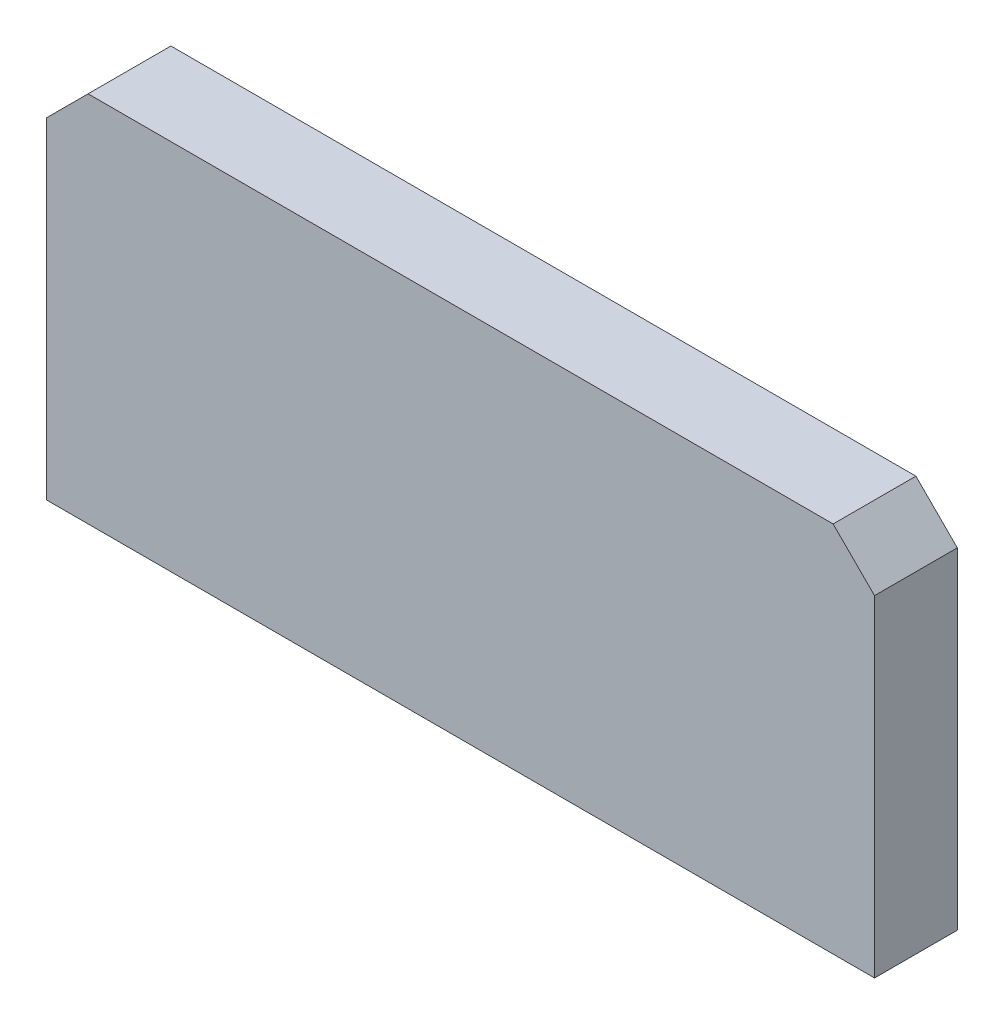
ISO-10303-21;
HEADER;
FILE_DESCRIPTION(('STEP AP214'),'2;1');
FILE_NAME('part.step','',(''),(''),'','','');
FILE_SCHEMA(('AUTOMOTIVE_DESIGN { 1 0 10303 214 1 1 1 1 }'));
ENDSEC;
DATA;
#1=APPLICATION_CONTEXT('core data for automotive mechanical design processes');
#2=APPLICATION_PROTOCOL_DEFINITION('international standard','automotive_design',2000,#1);
#3=PRODUCT_CONTEXT('',#1,'mechanical');
#4=PRODUCT('Part','Part','',(#3));
#5=PRODUCT_RELATED_PRODUCT_CATEGORY('part','',(#4));
#6=PRODUCT_DEFINITION_FORMATION('','',#4);
#7=PRODUCT_DEFINITION_CONTEXT('part definition',#1,'design');
#8=PRODUCT_DEFINITION('design','',#6,#7);
#9=PRODUCT_DEFINITION_SHAPE('','',#8);
#10=(LENGTH_UNIT() NAMED_UNIT(*) SI_UNIT(.MILLI.,.METRE.));
#11=(NAMED_UNIT(*) PLANE_ANGLE_UNIT() SI_UNIT($,.RADIAN.));
#12=(NAMED_UNIT(*) SI_UNIT($,.STERADIAN.) SOLID_ANGLE_UNIT());
#13=UNCERTAINTY_MEASURE_WITH_UNIT(LENGTH_MEASURE(1.E-05),#10,'distance_accuracy_value','');
#14=(GEOMETRIC_REPRESENTATION_CONTEXT(3) GLOBAL_UNCERTAINTY_ASSIGNED_CONTEXT((#13)) GLOBAL_UNIT_ASSIGNED_CONTEXT((#10,
#11,#12)) REPRESENTATION_CONTEXT('',''));
#15=CARTESIAN_POINT('',(0.,0.,0.));
#16=DIRECTION('',(0.,0.,1.));
#17=DIRECTION('',(1.,0.,0.));
#18=AXIS2_PLACEMENT_3D('',#15,#16,#17);
#19=CARTESIAN_POINT('',(50.,-20.,9.99999999999995));
#20=DIRECTION('',(0.,-1.,0.));
#21=DIRECTION('',(0.,0.,-1.));
#22=AXIS2_PLACEMENT_3D('',#19,#20,#21);
#23=PLANE('',#22);
#24=DIRECTION('',(-1.,0.,0.));
#25=VECTOR('',#24,1.);
#26=CARTESIAN_POINT('',(50.,-20.,0.));
#27=LINE('',#26,#25);
#28=CARTESIAN_POINT('',(50.,-20.,0.));
#29=VERTEX_POINT('',#28);
#30=CARTESIAN_POINT('',(-50.,-20.,0.));
#31=VERTEX_POINT('',#30);
#32=EDGE_CURVE('E135',#29,#31,#27,.T.);
#33=ORIENTED_EDGE('',*,*,#32,.F.);
#34=DIRECTION('',(0.,0.,-1.));
#35=VECTOR('',#34,1.);
#36=CARTESIAN_POINT('',(50.,-20.,9.99999999999995));
#37=LINE('',#36,#35);
#38=CARTESIAN_POINT('',(50.,-20.,9.99999999999995));
#39=VERTEX_POINT('',#38);
#40=EDGE_CURVE('E11',#39,#29,#37,.T.);
#41=ORIENTED_EDGE('',*,*,#40,.F.);
#42=DIRECTION('',(-1.,0.,0.));
#43=VECTOR('',#42,1.);
#44=CARTESIAN_POINT('',(50.,-20.,9.99999999999995));
#45=LINE('',#44,#43);
#46=CARTESIAN_POINT('',(-50.,-20.,10.));
#47=VERTEX_POINT('',#46);
#48=EDGE_CURVE('E155',#39,#47,#45,.T.);
#49=ORIENTED_EDGE('',*,*,#48,.T.);
#50=DIRECTION('',(0.,0.,-1.));
#51=VECTOR('',#50,1.);
#52=CARTESIAN_POINT('',(-50.,-20.,10.));
#53=LINE('',#52,#51);
#54=EDGE_CURVE('E46',#47,#31,#53,.T.);
#55=ORIENTED_EDGE('',*,*,#54,.T.);
#56=EDGE_LOOP('',(#33,#41,#49,#55));
#57=FACE_BOUND('',#56,.T.);
#58=ADVANCED_FACE('F43',(#57),#23,.T.);
#59=CARTESIAN_POINT('',(50.,20.,9.99999999999995));
#60=DIRECTION('',(1.,0.,0.));
#61=DIRECTION('',(0.,1.,0.));
#62=AXIS2_PLACEMENT_3D('',#59,#60,#61);
#63=PLANE('',#62);
#64=DIRECTION('',(0.,-1.,0.));
#65=VECTOR('',#64,1.);
#66=CARTESIAN_POINT('',(50.,20.,0.));
#67=LINE('',#66,#65);
#68=CARTESIAN_POINT('',(50.,20.,0.));
#69=VERTEX_POINT('',#68);
#70=EDGE_CURVE('E152',#69,#29,#67,.T.);
#71=ORIENTED_EDGE('',*,*,#70,.F.);
#72=DIRECTION('',(0.,0.,-1.));
#73=VECTOR('',#72,1.);
#74=CARTESIAN_POINT('',(50.,20.,9.99999999999995));
#75=LINE('',#74,#73);
#76=CARTESIAN_POINT('',(50.,20.,9.99999999999995));
#77=VERTEX_POINT('',#76);
#78=EDGE_CURVE('E53',#77,#69,#75,.T.);
#79=ORIENTED_EDGE('',*,*,#78,.F.);
#80=DIRECTION('',(0.,-1.,0.));
#81=VECTOR('',#80,1.);
#82=CARTESIAN_POINT('',(50.,20.,9.99999999999995));
#83=LINE('',#82,#81);
#84=EDGE_CURVE('E120',#77,#39,#83,.T.);
#85=ORIENTED_EDGE('',*,*,#84,.T.);
#86=ORIENTED_EDGE('',*,*,#40,.T.);
#87=EDGE_LOOP('',(#71,#79,#85,#86));
#88=FACE_BOUND('',#87,.T.);
#89=ADVANCED_FACE('F169',(#88),#63,.T.);
#90=CARTESIAN_POINT('',(45.,25.,10.));
#91=DIRECTION('',(0.707106781186548,0.707106781186546,0.));
#92=DIRECTION('',(-0.707106781186547,0.707106781186548,0.));
#93=AXIS2_PLACEMENT_3D('',#90,#91,#92);
#94=PLANE('',#93);
#95=DIRECTION('',(0.707106781186546,-0.707106781186548,0.));
#96=VECTOR('',#95,1.);
#97=CARTESIAN_POINT('',(45.,25.,0.));
#98=LINE('',#97,#96);
#99=CARTESIAN_POINT('',(45.,25.,0.));
#100=VERTEX_POINT('',#99);
#101=EDGE_CURVE('E106',#100,#69,#98,.T.);
#102=ORIENTED_EDGE('',*,*,#101,.F.);
#103=DIRECTION('',(0.,0.,-1.));
#104=VECTOR('',#103,1.);
#105=CARTESIAN_POINT('',(45.,25.,10.));
#106=LINE('',#105,#104);
#107=CARTESIAN_POINT('',(45.,25.,10.));
#108=VERTEX_POINT('',#107);
#109=EDGE_CURVE('E101',#108,#100,#106,.T.);
#110=ORIENTED_EDGE('',*,*,#109,.F.);
#111=DIRECTION('',(0.707106781186546,-0.707106781186548,0.));
#112=VECTOR('',#111,1.);
#113=CARTESIAN_POINT('',(45.,25.,10.));
#114=LINE('',#113,#112);
#115=EDGE_CURVE('E104',#108,#77,#114,.T.);
#116=ORIENTED_EDGE('',*,*,#115,.T.);
#117=ORIENTED_EDGE('',*,*,#78,.T.);
#118=EDGE_LOOP('',(#102,#110,#116,#117));
#119=FACE_BOUND('',#118,.T.);
#120=ADVANCED_FACE('F103',(#119),#94,.T.);
#121=CARTESIAN_POINT('',(-45.,25.,10.));
#122=DIRECTION('',(0.,1.,0.));
#123=DIRECTION('',(-1.,0.,0.));
#124=AXIS2_PLACEMENT_3D('',#121,#122,#123);
#125=PLANE('',#124);
#126=DIRECTION('',(1.,0.,0.));
#127=VECTOR('',#126,1.);
#128=CARTESIAN_POINT('',(-45.,25.,0.));
#129=LINE('',#128,#127);
#130=CARTESIAN_POINT('',(-45.,25.,0.));
#131=VERTEX_POINT('',#130);
#132=EDGE_CURVE('E147',#131,#100,#129,.T.);
#133=ORIENTED_EDGE('',*,*,#132,.F.);
#134=DIRECTION('',(0.,0.,-1.));
#135=VECTOR('',#134,1.);
#136=CARTESIAN_POINT('',(-45.,25.,10.));
#137=LINE('',#136,#135);
#138=CARTESIAN_POINT('',(-45.,25.,10.));
#139=VERTEX_POINT('',#138);
#140=EDGE_CURVE('E112',#139,#131,#137,.T.);
#141=ORIENTED_EDGE('',*,*,#140,.F.);
#142=DIRECTION('',(1.,0.,0.));
#143=VECTOR('',#142,1.);
#144=CARTESIAN_POINT('',(-45.,25.,10.));
#145=LINE('',#144,#143);
#146=EDGE_CURVE('E118',#139,#108,#145,.T.);
#147=ORIENTED_EDGE('',*,*,#146,.T.);
#148=ORIENTED_EDGE('',*,*,#109,.T.);
#149=EDGE_LOOP('',(#133,#141,#147,#148));
#150=FACE_BOUND('',#149,.T.);
#151=ADVANCED_FACE('F123',(#150),#125,.T.);
#152=CARTESIAN_POINT('',(-50.,20.,10.));
#153=DIRECTION('',(-0.707106781186548,0.707106781186546,0.));
#154=DIRECTION('',(-0.707106781186547,-0.707106781186548,0.));
#155=AXIS2_PLACEMENT_3D('',#152,#153,#154);
#156=PLANE('',#155);
#157=DIRECTION('',(0.707106781186546,0.707106781186548,0.));
#158=VECTOR('',#157,1.);
#159=CARTESIAN_POINT('',(-50.,20.,0.));
#160=LINE('',#159,#158);
#161=CARTESIAN_POINT('',(-50.,20.,0.));
#162=VERTEX_POINT('',#161);
#163=EDGE_CURVE('E143',#162,#131,#160,.T.);
#164=ORIENTED_EDGE('',*,*,#163,.F.);
#165=DIRECTION('',(0.,0.,-1.));
#166=VECTOR('',#165,1.);
#167=CARTESIAN_POINT('',(-50.,20.,10.));
#168=LINE('',#167,#166);
#169=CARTESIAN_POINT('',(-50.,20.,10.));
#170=VERTEX_POINT('',#169);
#171=EDGE_CURVE('E160',#170,#162,#168,.T.);
#172=ORIENTED_EDGE('',*,*,#171,.F.);
#173=DIRECTION('',(0.707106781186546,0.707106781186548,0.));
#174=VECTOR('',#173,1.);
#175=CARTESIAN_POINT('',(-50.,20.,10.));
#176=LINE('',#175,#174);
#177=EDGE_CURVE('E125',#170,#139,#176,.T.);
#178=ORIENTED_EDGE('',*,*,#177,.T.);
#179=ORIENTED_EDGE('',*,*,#140,.T.);
#180=EDGE_LOOP('',(#164,#172,#178,#179));
#181=FACE_BOUND('',#180,.T.);
#182=ADVANCED_FACE('F182',(#181),#156,.T.);
#183=CARTESIAN_POINT('',(-50.,-20.,10.));
#184=DIRECTION('',(-1.,0.,0.));
#185=DIRECTION('',(0.,0.,1.));
#186=AXIS2_PLACEMENT_3D('',#183,#184,#185);
#187=PLANE('',#186);
#188=DIRECTION('',(0.,1.,0.));
#189=VECTOR('',#188,1.);
#190=CARTESIAN_POINT('',(-50.,-20.,0.));
#191=LINE('',#190,#189);
#192=EDGE_CURVE('E139',#31,#162,#191,.T.);
#193=ORIENTED_EDGE('',*,*,#192,.F.);
#194=ORIENTED_EDGE('',*,*,#54,.F.);
#195=DIRECTION('',(0.,1.,0.));
#196=VECTOR('',#195,1.);
#197=CARTESIAN_POINT('',(-50.,-20.,10.));
#198=LINE('',#197,#196);
#199=EDGE_CURVE('E129',#47,#170,#198,.T.);
#200=ORIENTED_EDGE('',*,*,#199,.T.);
#201=ORIENTED_EDGE('',*,*,#171,.T.);
#202=EDGE_LOOP('',(#193,#194,#200,#201));
#203=FACE_BOUND('',#202,.T.);
#204=ADVANCED_FACE('F166',(#203),#187,.T.);
#205=CARTESIAN_POINT('',(0.,0.,10.));
#206=DIRECTION('',(0.,0.,-1.));
#207=DIRECTION('',(-1.,0.,0.));
#208=AXIS2_PLACEMENT_3D('',#205,#206,#207);
#209=PLANE('',#208);
#210=ORIENTED_EDGE('',*,*,#48,.F.);
#211=ORIENTED_EDGE('',*,*,#84,.F.);
#212=ORIENTED_EDGE('',*,*,#115,.F.);
#213=ORIENTED_EDGE('',*,*,#146,.F.);
#214=ORIENTED_EDGE('',*,*,#177,.F.);
#215=ORIENTED_EDGE('',*,*,#199,.F.);
#216=EDGE_LOOP('',(#210,#211,#212,#213,#214,#215));
#217=FACE_BOUND('',#216,.T.);
#218=ADVANCED_FACE('F116',(#217),#209,.F.);
#219=CARTESIAN_POINT('',(0.,0.,0.));
#220=DIRECTION('',(0.,0.,-1.));
#221=DIRECTION('',(-1.,0.,0.));
#222=AXIS2_PLACEMENT_3D('',#219,#220,#221);
#223=PLANE('',#222);
#224=ORIENTED_EDGE('',*,*,#32,.T.);
#225=ORIENTED_EDGE('',*,*,#192,.T.);
#226=ORIENTED_EDGE('',*,*,#163,.T.);
#227=ORIENTED_EDGE('',*,*,#132,.T.);
#228=ORIENTED_EDGE('',*,*,#101,.T.);
#229=ORIENTED_EDGE('',*,*,#70,.T.);
#230=EDGE_LOOP('',(#224,#225,#226,#227,#228,#229));
#231=FACE_BOUND('',#230,.T.);
#232=ADVANCED_FACE('F168',(#231),#223,.T.);
#233=CLOSED_SHELL('',(#58,#89,#120,#151,#182,#204,#218,#232));
#234=MANIFOLD_SOLID_BREP('B2',#233);
#235=ADVANCED_BREP_SHAPE_REPRESENTATION('',(#18,#234),#14);
#236=SHAPE_DEFINITION_REPRESENTATION(#9,#235);
ENDSEC;
END-ISO-10303-21;
